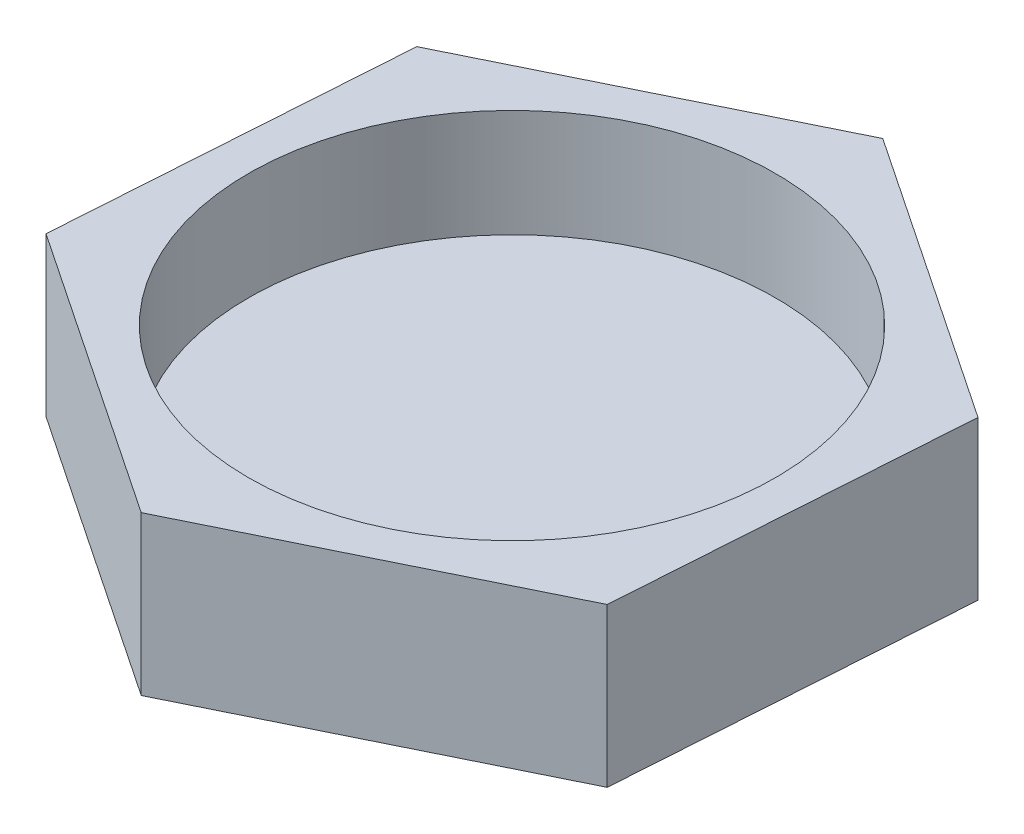
ISO-10303-21;
HEADER;
FILE_DESCRIPTION(('STEP AP214'),'2;1');
FILE_NAME('part.step','',(''),(''),'','','');
FILE_SCHEMA(('AUTOMOTIVE_DESIGN { 1 0 10303 214 1 1 1 1 }'));
ENDSEC;
DATA;
#1=APPLICATION_CONTEXT('core data for automotive mechanical design processes');
#2=APPLICATION_PROTOCOL_DEFINITION('international standard','automotive_design',2000,#1);
#3=PRODUCT_CONTEXT('',#1,'mechanical');
#4=PRODUCT('Part','Part','',(#3));
#5=PRODUCT_RELATED_PRODUCT_CATEGORY('part','',(#4));
#6=PRODUCT_DEFINITION_FORMATION('','',#4);
#7=PRODUCT_DEFINITION_CONTEXT('part definition',#1,'design');
#8=PRODUCT_DEFINITION('design','',#6,#7);
#9=PRODUCT_DEFINITION_SHAPE('','',#8);
#10=(LENGTH_UNIT() NAMED_UNIT(*) SI_UNIT(.MILLI.,.METRE.));
#11=(NAMED_UNIT(*) PLANE_ANGLE_UNIT() SI_UNIT($,.RADIAN.));
#12=(NAMED_UNIT(*) SI_UNIT($,.STERADIAN.) SOLID_ANGLE_UNIT());
#13=UNCERTAINTY_MEASURE_WITH_UNIT(LENGTH_MEASURE(1.E-05),#10,'distance_accuracy_value','');
#14=(GEOMETRIC_REPRESENTATION_CONTEXT(3) GLOBAL_UNCERTAINTY_ASSIGNED_CONTEXT((#13)) GLOBAL_UNIT_ASSIGNED_CONTEXT((#10,
#11,#12)) REPRESENTATION_CONTEXT('',''));
#15=CARTESIAN_POINT('',(0.,0.,0.));
#16=DIRECTION('',(0.,0.,1.));
#17=DIRECTION('',(1.,0.,0.));
#18=AXIS2_PLACEMENT_3D('',#15,#16,#17);
#19=CARTESIAN_POINT('',(-1.17132735789698,7.9375,17.4116345457276));
#20=DIRECTION('',(-0.440743955573524,0.,-0.897632867950702));
#21=DIRECTION('',(-0.897632867950702,0.,0.440743955573524));
#22=AXIS2_PLACEMENT_3D('',#19,#20,#21);
#23=PLANE('',#22);
#24=DIRECTION('',(0.897632867950703,0.,-0.440743955573525));
#25=VECTOR('',#24,1.);
#26=CARTESIAN_POINT('',(-1.17132735789698,0.,17.4116345457276));
#27=LINE('',#26,#25);
#28=CARTESIAN_POINT('',(-1.17132735789698,0.,17.4116345457276));
#29=VERTEX_POINT('',#28);
#30=CARTESIAN_POINT('',(14.4932541590624,0.,9.72021652095031));
#31=VERTEX_POINT('',#30);
#32=EDGE_CURVE('E123',#29,#31,#27,.T.);
#33=ORIENTED_EDGE('',*,*,#32,.T.);
#34=DIRECTION('',(0.,-1.,0.));
#35=VECTOR('',#34,1.);
#36=CARTESIAN_POINT('',(14.4932541590624,7.9375,9.72021652095031));
#37=LINE('',#36,#35);
#38=CARTESIAN_POINT('',(14.4932541590624,7.9375,9.72021652095031));
#39=VERTEX_POINT('',#38);
#40=EDGE_CURVE('E12',#39,#31,#37,.T.);
#41=ORIENTED_EDGE('',*,*,#40,.F.);
#42=DIRECTION('',(0.897632867950703,0.,-0.440743955573525));
#43=VECTOR('',#42,1.);
#44=CARTESIAN_POINT('',(-1.17132735789698,7.9375,17.4116345457276));
#45=LINE('',#44,#43);
#46=CARTESIAN_POINT('',(-1.17132735789698,7.9375,17.4116345457276));
#47=VERTEX_POINT('',#46);
#48=EDGE_CURVE('E134',#47,#39,#45,.T.);
#49=ORIENTED_EDGE('',*,*,#48,.F.);
#50=DIRECTION('',(0.,-1.,0.));
#51=VECTOR('',#50,1.);
#52=CARTESIAN_POINT('',(-1.17132735789698,7.9375,17.4116345457276));
#53=LINE('',#52,#51);
#54=EDGE_CURVE('E119',#47,#29,#53,.T.);
#55=ORIENTED_EDGE('',*,*,#54,.T.);
#56=EDGE_LOOP('',(#33,#41,#49,#55));
#57=FACE_BOUND('',#56,.T.);
#58=ADVANCED_FACE('F39',(#57),#23,.F.);
#59=CARTESIAN_POINT('',(14.4932541590624,7.9375,9.72021652095031));
#60=DIRECTION('',(-0.997744844703953,0.,-0.0671209718842382));
#61=DIRECTION('',(-0.0671209718842382,0.,0.997744844703953));
#62=AXIS2_PLACEMENT_3D('',#59,#60,#61);
#63=PLANE('',#62);
#64=DIRECTION('',(0.0671209718842381,0.,-0.997744844703953));
#65=VECTOR('',#64,1.);
#66=CARTESIAN_POINT('',(14.4932541590624,0.,9.72021652095031));
#67=LINE('',#66,#65);
#68=CARTESIAN_POINT('',(15.6645815169593,0.,-7.69141802477731));
#69=VERTEX_POINT('',#68);
#70=EDGE_CURVE('E126',#31,#69,#67,.T.);
#71=ORIENTED_EDGE('',*,*,#70,.T.);
#72=DIRECTION('',(0.,-1.,0.));
#73=VECTOR('',#72,1.);
#74=CARTESIAN_POINT('',(15.6645815169593,7.9375,-7.69141802477731));
#75=LINE('',#74,#73);
#76=CARTESIAN_POINT('',(15.6645815169593,7.9375,-7.69141802477731));
#77=VERTEX_POINT('',#76);
#78=EDGE_CURVE('E47',#77,#69,#75,.T.);
#79=ORIENTED_EDGE('',*,*,#78,.F.);
#80=DIRECTION('',(0.0671209718842381,0.,-0.997744844703953));
#81=VECTOR('',#80,1.);
#82=CARTESIAN_POINT('',(14.4932541590624,7.9375,9.72021652095031));
#83=LINE('',#82,#81);
#84=EDGE_CURVE('E92',#39,#77,#83,.T.);
#85=ORIENTED_EDGE('',*,*,#84,.F.);
#86=ORIENTED_EDGE('',*,*,#40,.T.);
#87=EDGE_LOOP('',(#71,#79,#85,#86));
#88=FACE_BOUND('',#87,.T.);
#89=ADVANCED_FACE('F159',(#88),#63,.F.);
#90=CARTESIAN_POINT('',(15.6645815169593,7.9375,-7.69141802477731));
#91=DIRECTION('',(-0.557000889130428,0.,0.830511896066463));
#92=DIRECTION('',(0.830511896066463,0.,0.557000889130428));
#93=AXIS2_PLACEMENT_3D('',#90,#91,#92);
#94=PLANE('',#93);
#95=DIRECTION('',(-0.830511896066463,0.,-0.557000889130428));
#96=VECTOR('',#95,1.);
#97=CARTESIAN_POINT('',(15.6645815169593,0.,-7.69141802477731));
#98=LINE('',#97,#96);
#99=CARTESIAN_POINT('',(1.17132735789699,0.,-17.4116345457276));
#100=VERTEX_POINT('',#99);
#101=EDGE_CURVE('E129',#69,#100,#98,.T.);
#102=ORIENTED_EDGE('',*,*,#101,.T.);
#103=DIRECTION('',(0.,-1.,0.));
#104=VECTOR('',#103,1.);
#105=CARTESIAN_POINT('',(1.17132735789699,7.9375,-17.4116345457276));
#106=LINE('',#105,#104);
#107=CARTESIAN_POINT('',(1.17132735789699,7.9375,-17.4116345457276));
#108=VERTEX_POINT('',#107);
#109=EDGE_CURVE('E114',#108,#100,#106,.T.);
#110=ORIENTED_EDGE('',*,*,#109,.F.);
#111=DIRECTION('',(-0.830511896066463,0.,-0.557000889130428));
#112=VECTOR('',#111,1.);
#113=CARTESIAN_POINT('',(15.6645815169593,7.9375,-7.69141802477731));
#114=LINE('',#113,#112);
#115=EDGE_CURVE('E105',#77,#108,#114,.T.);
#116=ORIENTED_EDGE('',*,*,#115,.F.);
#117=ORIENTED_EDGE('',*,*,#78,.T.);
#118=EDGE_LOOP('',(#102,#110,#116,#117));
#119=FACE_BOUND('',#118,.T.);
#120=ADVANCED_FACE('F140',(#119),#94,.F.);
#121=CARTESIAN_POINT('',(1.17132735789699,7.9375,-17.4116345457276));
#122=DIRECTION('',(0.440743955573525,0.,0.897632867950702));
#123=DIRECTION('',(0.897632867950702,0.,-0.440743955573525));
#124=AXIS2_PLACEMENT_3D('',#121,#122,#123);
#125=PLANE('',#124);
#126=DIRECTION('',(-0.897632867950703,0.,0.440743955573525));
#127=VECTOR('',#126,1.);
#128=CARTESIAN_POINT('',(1.17132735789699,0.,-17.4116345457276));
#129=LINE('',#128,#127);
#130=CARTESIAN_POINT('',(-14.4932541590623,0.,-9.72021652095031));
#131=VERTEX_POINT('',#130);
#132=EDGE_CURVE('E113',#100,#131,#129,.T.);
#133=ORIENTED_EDGE('',*,*,#132,.T.);
#134=DIRECTION('',(0.,-1.,0.));
#135=VECTOR('',#134,1.);
#136=CARTESIAN_POINT('',(-14.4932541590623,7.9375,-9.72021652095031));
#137=LINE('',#136,#135);
#138=CARTESIAN_POINT('',(-14.4932541590623,7.9375,-9.72021652095031));
#139=VERTEX_POINT('',#138);
#140=EDGE_CURVE('E110',#139,#131,#137,.T.);
#141=ORIENTED_EDGE('',*,*,#140,.F.);
#142=DIRECTION('',(-0.897632867950703,0.,0.440743955573525));
#143=VECTOR('',#142,1.);
#144=CARTESIAN_POINT('',(1.17132735789699,7.9375,-17.4116345457276));
#145=LINE('',#144,#143);
#146=EDGE_CURVE('E99',#108,#139,#145,.T.);
#147=ORIENTED_EDGE('',*,*,#146,.F.);
#148=ORIENTED_EDGE('',*,*,#109,.T.);
#149=EDGE_LOOP('',(#133,#141,#147,#148));
#150=FACE_BOUND('',#149,.T.);
#151=ADVANCED_FACE('F111',(#150),#125,.F.);
#152=CARTESIAN_POINT('',(-14.4932541590623,7.9375,-9.72021652095031));
#153=DIRECTION('',(0.997744844703953,0.,0.0671209718842387));
#154=DIRECTION('',(0.0671209718842387,0.,-0.997744844703953));
#155=AXIS2_PLACEMENT_3D('',#152,#153,#154);
#156=PLANE('',#155);
#157=DIRECTION('',(-0.0671209718842386,0.,0.997744844703953));
#158=VECTOR('',#157,1.);
#159=CARTESIAN_POINT('',(-14.4932541590623,0.,-9.72021652095031));
#160=LINE('',#159,#158);
#161=CARTESIAN_POINT('',(-15.6645815169593,0.,7.69141802477731));
#162=VERTEX_POINT('',#161);
#163=EDGE_CURVE('E78',#131,#162,#160,.T.);
#164=ORIENTED_EDGE('',*,*,#163,.T.);
#165=DIRECTION('',(0.,-1.,0.));
#166=VECTOR('',#165,1.);
#167=CARTESIAN_POINT('',(-15.6645815169593,7.9375,7.69141802477731));
#168=LINE('',#167,#166);
#169=CARTESIAN_POINT('',(-15.6645815169593,7.9375,7.69141802477731));
#170=VERTEX_POINT('',#169);
#171=EDGE_CURVE('E115',#170,#162,#168,.T.);
#172=ORIENTED_EDGE('',*,*,#171,.F.);
#173=DIRECTION('',(-0.0671209718842386,0.,0.997744844703953));
#174=VECTOR('',#173,1.);
#175=CARTESIAN_POINT('',(-14.4932541590623,7.9375,-9.72021652095031));
#176=LINE('',#175,#174);
#177=EDGE_CURVE('E103',#139,#170,#176,.T.);
#178=ORIENTED_EDGE('',*,*,#177,.F.);
#179=ORIENTED_EDGE('',*,*,#140,.T.);
#180=EDGE_LOOP('',(#164,#172,#178,#179));
#181=FACE_BOUND('',#180,.T.);
#182=ADVANCED_FACE('F117',(#181),#156,.F.);
#183=CARTESIAN_POINT('',(-15.6645815169593,7.9375,7.69141802477731));
#184=DIRECTION('',(0.557000889130428,0.,-0.830511896066464));
#185=DIRECTION('',(-0.830511896066464,0.,-0.557000889130428));
#186=AXIS2_PLACEMENT_3D('',#183,#184,#185);
#187=PLANE('',#186);
#188=DIRECTION('',(0.830511896066463,0.,0.557000889130428));
#189=VECTOR('',#188,1.);
#190=CARTESIAN_POINT('',(-15.6645815169593,0.,7.69141802477731));
#191=LINE('',#190,#189);
#192=EDGE_CURVE('E84',#162,#29,#191,.T.);
#193=ORIENTED_EDGE('',*,*,#192,.T.);
#194=ORIENTED_EDGE('',*,*,#54,.F.);
#195=DIRECTION('',(0.830511896066463,0.,0.557000889130428));
#196=VECTOR('',#195,1.);
#197=CARTESIAN_POINT('',(-15.6645815169593,7.9375,7.69141802477731));
#198=LINE('',#197,#196);
#199=EDGE_CURVE('E55',#170,#47,#198,.T.);
#200=ORIENTED_EDGE('',*,*,#199,.F.);
#201=ORIENTED_EDGE('',*,*,#171,.T.);
#202=EDGE_LOOP('',(#193,#194,#200,#201));
#203=FACE_BOUND('',#202,.T.);
#204=ADVANCED_FACE('F147',(#203),#187,.F.);
#205=CARTESIAN_POINT('',(0.,7.9375,0.));
#206=DIRECTION('',(0.,1.,0.));
#207=DIRECTION('',(0.,0.,1.));
#208=AXIS2_PLACEMENT_3D('',#205,#206,#207);
#209=PLANE('',#208);
#210=CARTESIAN_POINT('',(0.,7.9375,0.));
#211=DIRECTION('',(0.,1.,0.));
#212=DIRECTION('',(0.,0.,1.));
#213=AXIS2_PLACEMENT_3D('',#210,#211,#212);
#214=CIRCLE('',#213,13.208);
#215=CARTESIAN_POINT('',(0.,7.9375,13.208));
#216=VERTEX_POINT('',#215);
#217=EDGE_CURVE('E254',#216,#216,#214,.T.);
#218=ORIENTED_EDGE('',*,*,#217,.F.);
#219=EDGE_LOOP('',(#218));
#220=FACE_BOUND('',#219,.T.);
#221=ORIENTED_EDGE('',*,*,#48,.T.);
#222=ORIENTED_EDGE('',*,*,#84,.T.);
#223=ORIENTED_EDGE('',*,*,#115,.T.);
#224=ORIENTED_EDGE('',*,*,#146,.T.);
#225=ORIENTED_EDGE('',*,*,#177,.T.);
#226=ORIENTED_EDGE('',*,*,#199,.T.);
#227=EDGE_LOOP('',(#221,#222,#223,#224,#225,#226));
#228=FACE_BOUND('',#227,.T.);
#229=ADVANCED_FACE('F101',(#220,#228),#209,.T.);
#230=CARTESIAN_POINT('',(0.,0.,0.));
#231=DIRECTION('',(0.,1.,0.));
#232=DIRECTION('',(0.,0.,1.));
#233=AXIS2_PLACEMENT_3D('',#230,#231,#232);
#234=PLANE('',#233);
#235=ORIENTED_EDGE('',*,*,#32,.F.);
#236=ORIENTED_EDGE('',*,*,#192,.F.);
#237=ORIENTED_EDGE('',*,*,#163,.F.);
#238=ORIENTED_EDGE('',*,*,#132,.F.);
#239=ORIENTED_EDGE('',*,*,#101,.F.);
#240=ORIENTED_EDGE('',*,*,#70,.F.);
#241=EDGE_LOOP('',(#235,#236,#237,#238,#239,#240));
#242=FACE_BOUND('',#241,.T.);
#243=ADVANCED_FACE('F143',(#242),#234,.F.);
#244=CARTESIAN_POINT('',(0.,-37.3578654636477,0.));
#245=DIRECTION('',(0.,1.,0.));
#246=DIRECTION('',(0.,0.,1.));
#247=AXIS2_PLACEMENT_3D('',#244,#245,#246);
#248=CYLINDRICAL_SURFACE('',#247,13.208);
#249=CARTESIAN_POINT('',(0.,2.54,0.));
#250=DIRECTION('',(0.,1.,0.));
#251=DIRECTION('',(0.,0.,1.));
#252=AXIS2_PLACEMENT_3D('',#249,#250,#251);
#253=CIRCLE('',#252,13.208);
#254=CARTESIAN_POINT('',(0.,2.54,13.208));
#255=VERTEX_POINT('',#254);
#256=EDGE_CURVE('E127',#255,#255,#253,.F.);
#257=ORIENTED_EDGE('',*,*,#256,.T.);
#258=EDGE_LOOP('',(#257));
#259=FACE_BOUND('',#258,.T.);
#260=ORIENTED_EDGE('',*,*,#217,.T.);
#261=EDGE_LOOP('',(#260));
#262=FACE_BOUND('',#261,.T.);
#263=ADVANCED_FACE('F197',(#259,#262),#248,.F.);
#264=CARTESIAN_POINT('',(0.,2.54,0.));
#265=DIRECTION('',(0.,1.,0.));
#266=DIRECTION('',(0.,0.,1.));
#267=AXIS2_PLACEMENT_3D('',#264,#265,#266);
#268=PLANE('',#267);
#269=ORIENTED_EDGE('',*,*,#256,.F.);
#270=EDGE_LOOP('',(#269));
#271=FACE_BOUND('',#270,.T.);
#272=ADVANCED_FACE('F204',(#271),#268,.T.);
#273=CLOSED_SHELL('',(#58,#89,#120,#151,#182,#204,#229,#243,#263,#272));
#274=MANIFOLD_SOLID_BREP('B2',#273);
#275=ADVANCED_BREP_SHAPE_REPRESENTATION('',(#18,#274),#14);
#276=SHAPE_DEFINITION_REPRESENTATION(#9,#275);
ENDSEC;
END-ISO-10303-21;
